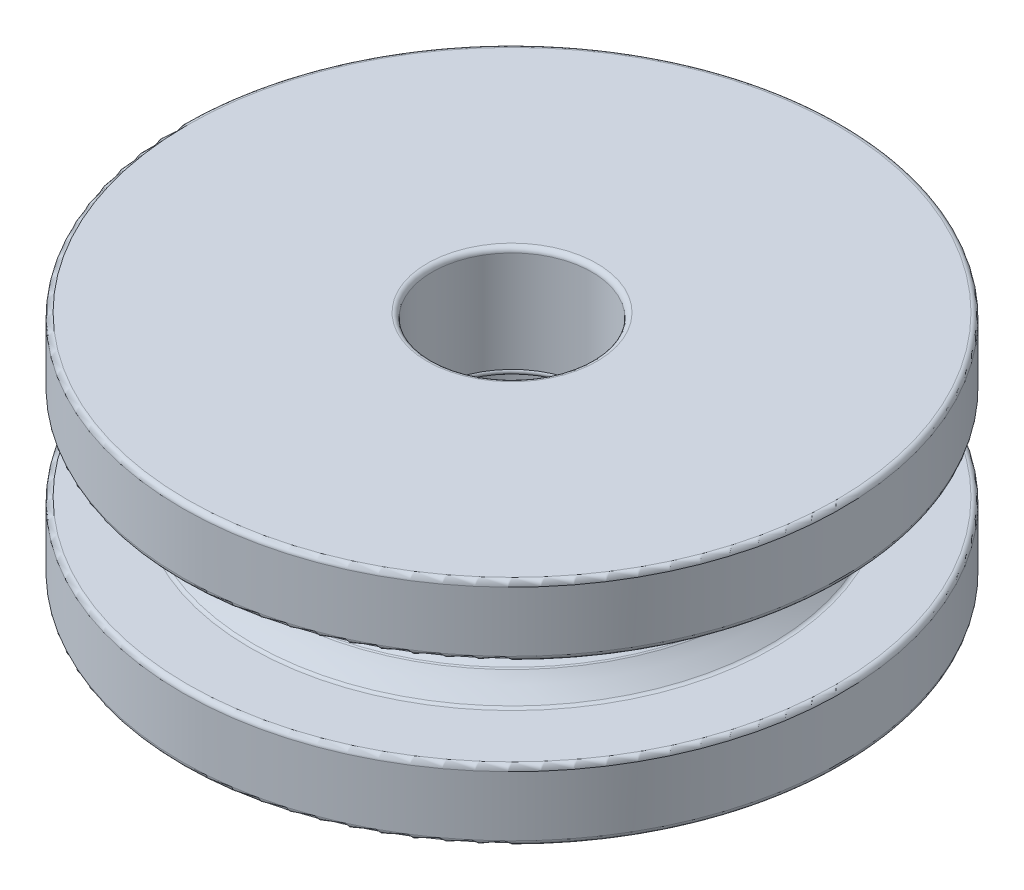
ISO-10303-21;
HEADER;
FILE_DESCRIPTION(('STEP AP214'),'2;1');
FILE_NAME('part.step','',(''),(''),'','','');
FILE_SCHEMA(('AUTOMOTIVE_DESIGN { 1 0 10303 214 1 1 1 1 }'));
ENDSEC;
DATA;
#1=APPLICATION_CONTEXT('core data for automotive mechanical design processes');
#2=APPLICATION_PROTOCOL_DEFINITION('international standard','automotive_design',2000,#1);
#3=PRODUCT_CONTEXT('',#1,'mechanical');
#4=PRODUCT('Part','Part','',(#3));
#5=PRODUCT_RELATED_PRODUCT_CATEGORY('part','',(#4));
#6=PRODUCT_DEFINITION_FORMATION('','',#4);
#7=PRODUCT_DEFINITION_CONTEXT('part definition',#1,'design');
#8=PRODUCT_DEFINITION('design','',#6,#7);
#9=PRODUCT_DEFINITION_SHAPE('','',#8);
#10=(LENGTH_UNIT() NAMED_UNIT(*) SI_UNIT(.MILLI.,.METRE.));
#11=(NAMED_UNIT(*) PLANE_ANGLE_UNIT() SI_UNIT($,.RADIAN.));
#12=(NAMED_UNIT(*) SI_UNIT($,.STERADIAN.) SOLID_ANGLE_UNIT());
#13=UNCERTAINTY_MEASURE_WITH_UNIT(LENGTH_MEASURE(1.E-05),#10,'distance_accuracy_value','');
#14=(GEOMETRIC_REPRESENTATION_CONTEXT(3) GLOBAL_UNCERTAINTY_ASSIGNED_CONTEXT((#13)) GLOBAL_UNIT_ASSIGNED_CONTEXT((#10,
#11,#12)) REPRESENTATION_CONTEXT('',''));
#15=CARTESIAN_POINT('',(0.,0.,0.));
#16=DIRECTION('',(0.,0.,1.));
#17=DIRECTION('',(1.,0.,0.));
#18=AXIS2_PLACEMENT_3D('',#15,#16,#17);
#19=CARTESIAN_POINT('',(0.,6.,0.));
#20=DIRECTION('',(0.,1.,0.));
#21=DIRECTION('',(0.,0.,1.));
#22=AXIS2_PLACEMENT_3D('',#19,#20,#21);
#23=PLANE('',#22);
#24=CARTESIAN_POINT('',(0.,6.,0.));
#25=DIRECTION('',(0.,-1.,0.));
#26=DIRECTION('',(0.,0.,-1.));
#27=AXIS2_PLACEMENT_3D('',#24,#25,#26);
#28=CIRCLE('',#27,4.2);
#29=CARTESIAN_POINT('',(0.,6.,-4.2));
#30=VERTEX_POINT('',#29);
#31=EDGE_CURVE('E124',#30,#30,#28,.T.);
#32=ORIENTED_EDGE('',*,*,#31,.T.);
#33=EDGE_LOOP('',(#32));
#34=FACE_BOUND('',#33,.T.);
#35=CARTESIAN_POINT('',(0.,6.,0.));
#36=DIRECTION('',(0.,1.,0.));
#37=DIRECTION('',(0.,0.,1.));
#38=AXIS2_PLACEMENT_3D('',#35,#36,#37);
#39=CIRCLE('',#38,8.);
#40=CARTESIAN_POINT('',(0.,6.,8.));
#41=VERTEX_POINT('',#40);
#42=EDGE_CURVE('E115',#41,#41,#39,.T.);
#43=ORIENTED_EDGE('',*,*,#42,.T.);
#44=EDGE_LOOP('',(#43));
#45=FACE_BOUND('',#44,.T.);
#46=ADVANCED_FACE('F47',(#34,#45),#23,.T.);
#47=CARTESIAN_POINT('',(0.,39.1304347826087,0.));
#48=DIRECTION('',(0.,1.,0.));
#49=DIRECTION('',(0.,0.,1.));
#50=AXIS2_PLACEMENT_3D('',#47,#48,#49);
#51=CYLINDRICAL_SURFACE('',#50,8.);
#52=CARTESIAN_POINT('',(0.,12.,0.));
#53=DIRECTION('',(0.,1.,0.));
#54=DIRECTION('',(0.,0.,1.));
#55=AXIS2_PLACEMENT_3D('',#52,#53,#54);
#56=CIRCLE('',#55,8.);
#57=CARTESIAN_POINT('',(0.,12.,8.));
#58=VERTEX_POINT('',#57);
#59=EDGE_CURVE('E118',#58,#58,#56,.T.);
#60=ORIENTED_EDGE('',*,*,#59,.T.);
#61=EDGE_LOOP('',(#60));
#62=FACE_BOUND('',#61,.T.);
#63=ORIENTED_EDGE('',*,*,#42,.F.);
#64=EDGE_LOOP('',(#63));
#65=FACE_BOUND('',#64,.T.);
#66=ADVANCED_FACE('F183',(#62,#65),#51,.F.);
#67=CARTESIAN_POINT('',(0.,12.1999861644354,0.));
#68=DIRECTION('',(0.,1.,0.));
#69=DIRECTION('',(0.,0.,1.));
#70=AXIS2_PLACEMENT_3D('',#67,#68,#69);
#71=TOROIDAL_SURFACE('',#70,8.25215006952186,0.321829339130951);
#72=CARTESIAN_POINT('',(0.,12.3999723288708,0.));
#73=DIRECTION('',(0.,1.,0.));
#74=DIRECTION('',(0.,0.,1.));
#75=AXIS2_PLACEMENT_3D('',#72,#73,#74);
#76=CIRCLE('',#75,8.);
#77=CARTESIAN_POINT('',(0.,12.3999723288708,8.));
#78=VERTEX_POINT('',#77);
#79=EDGE_CURVE('E121',#78,#78,#76,.T.);
#80=ORIENTED_EDGE('',*,*,#79,.T.);
#81=EDGE_LOOP('',(#80));
#82=FACE_BOUND('',#81,.T.);
#83=ORIENTED_EDGE('',*,*,#59,.F.);
#84=EDGE_LOOP('',(#83));
#85=FACE_BOUND('',#84,.T.);
#86=ADVANCED_FACE('F188',(#82,#85),#71,.T.);
#87=CARTESIAN_POINT('',(0.,39.1304347826087,0.));
#88=DIRECTION('',(0.,1.,0.));
#89=DIRECTION('',(0.,0.,1.));
#90=AXIS2_PLACEMENT_3D('',#87,#88,#89);
#91=CYLINDRICAL_SURFACE('',#90,8.);
#92=CARTESIAN_POINT('',(0.,22.5,0.));
#93=DIRECTION('',(0.,1.,0.));
#94=DIRECTION('',(0.,0.,1.));
#95=AXIS2_PLACEMENT_3D('',#92,#93,#94);
#96=CIRCLE('',#95,8.);
#97=CARTESIAN_POINT('',(0.,22.5,8.));
#98=VERTEX_POINT('',#97);
#99=EDGE_CURVE('E58',#98,#98,#96,.T.);
#100=ORIENTED_EDGE('',*,*,#99,.T.);
#101=EDGE_LOOP('',(#100));
#102=FACE_BOUND('',#101,.T.);
#103=ORIENTED_EDGE('',*,*,#79,.F.);
#104=EDGE_LOOP('',(#103));
#105=FACE_BOUND('',#104,.T.);
#106=ADVANCED_FACE('F229',(#102,#105),#91,.F.);
#107=CARTESIAN_POINT('',(0.,23.,33.));
#108=DIRECTION('',(0.,1.,0.));
#109=DIRECTION('',(0.,0.,1.));
#110=AXIS2_PLACEMENT_3D('',#107,#108,#109);
#111=PLANE('',#110);
#112=CARTESIAN_POINT('',(0.,23.,0.));
#113=DIRECTION('',(0.,1.,0.));
#114=DIRECTION('',(0.,0.,1.));
#115=AXIS2_PLACEMENT_3D('',#112,#113,#114);
#116=CIRCLE('',#115,8.5);
#117=CARTESIAN_POINT('',(0.,23.,8.5));
#118=VERTEX_POINT('',#117);
#119=EDGE_CURVE('E12',#118,#118,#116,.F.);
#120=ORIENTED_EDGE('',*,*,#119,.T.);
#121=EDGE_LOOP('',(#120));
#122=FACE_BOUND('',#121,.T.);
#123=CARTESIAN_POINT('',(0.,23.,0.));
#124=DIRECTION('',(0.,1.,0.));
#125=DIRECTION('',(0.,0.,1.));
#126=AXIS2_PLACEMENT_3D('',#123,#124,#125);
#127=CIRCLE('',#126,32.5);
#128=CARTESIAN_POINT('',(0.,23.,32.5));
#129=VERTEX_POINT('',#128);
#130=EDGE_CURVE('E54',#129,#129,#127,.T.);
#131=ORIENTED_EDGE('',*,*,#130,.T.);
#132=EDGE_LOOP('',(#131));
#133=FACE_BOUND('',#132,.T.);
#134=ADVANCED_FACE('F232',(#122,#133),#111,.T.);
#135=CARTESIAN_POINT('',(0.,39.1304347826087,0.));
#136=DIRECTION('',(0.,1.,0.));
#137=DIRECTION('',(0.,0.,1.));
#138=AXIS2_PLACEMENT_3D('',#135,#136,#137);
#139=CYLINDRICAL_SURFACE('',#138,33.);
#140=CARTESIAN_POINT('',(0.,16.5,0.));
#141=DIRECTION('',(0.,-1.,0.));
#142=DIRECTION('',(0.,0.,-1.));
#143=AXIS2_PLACEMENT_3D('',#140,#141,#142);
#144=CIRCLE('',#143,33.);
#145=CARTESIAN_POINT('',(0.,16.5,-33.));
#146=VERTEX_POINT('',#145);
#147=EDGE_CURVE('E79',#146,#146,#144,.F.);
#148=ORIENTED_EDGE('',*,*,#147,.T.);
#149=EDGE_LOOP('',(#148));
#150=FACE_BOUND('',#149,.T.);
#151=CARTESIAN_POINT('',(0.,22.5,0.));
#152=DIRECTION('',(0.,1.,0.));
#153=DIRECTION('',(0.,0.,1.));
#154=AXIS2_PLACEMENT_3D('',#151,#152,#153);
#155=CIRCLE('',#154,33.);
#156=CARTESIAN_POINT('',(0.,22.5,33.));
#157=VERTEX_POINT('',#156);
#158=EDGE_CURVE('E82',#157,#157,#155,.F.);
#159=ORIENTED_EDGE('',*,*,#158,.T.);
#160=EDGE_LOOP('',(#159));
#161=FACE_BOUND('',#160,.T.);
#162=ADVANCED_FACE('F245',(#150,#161),#139,.T.);
#163=CARTESIAN_POINT('',(0.,16.,33.));
#164=DIRECTION('',(0.,-1.,0.));
#165=DIRECTION('',(0.,0.,-1.));
#166=AXIS2_PLACEMENT_3D('',#163,#164,#165);
#167=PLANE('',#166);
#168=CARTESIAN_POINT('',(0.,16.,0.));
#169=DIRECTION('',(0.,-1.,0.));
#170=DIRECTION('',(0.,0.,-1.));
#171=AXIS2_PLACEMENT_3D('',#168,#169,#170);
#172=CIRCLE('',#171,32.5);
#173=CARTESIAN_POINT('',(0.,16.,-32.5));
#174=VERTEX_POINT('',#173);
#175=EDGE_CURVE('E73',#174,#174,#172,.T.);
#176=ORIENTED_EDGE('',*,*,#175,.T.);
#177=EDGE_LOOP('',(#176));
#178=FACE_BOUND('',#177,.T.);
#179=CARTESIAN_POINT('',(0.,16.,0.));
#180=DIRECTION('',(0.,-1.,0.));
#181=DIRECTION('',(0.,0.,-1.));
#182=AXIS2_PLACEMENT_3D('',#179,#180,#181);
#183=CIRCLE('',#182,26.2070983904245);
#184=CARTESIAN_POINT('',(0.,16.,-26.2070983904245));
#185=VERTEX_POINT('',#184);
#186=EDGE_CURVE('E76',#185,#185,#183,.F.);
#187=ORIENTED_EDGE('',*,*,#186,.T.);
#188=EDGE_LOOP('',(#187));
#189=FACE_BOUND('',#188,.T.);
#190=ADVANCED_FACE('F151',(#178,#189),#167,.T.);
#191=CARTESIAN_POINT('',(0.,16.,26.));
#192=CARTESIAN_POINT('',(0.,14.620109751411,24.6126431025041));
#193=CARTESIAN_POINT('',(0.,13.7977511971225,24.0805854446736));
#194=(BOUNDED_CURVE() B_SPLINE_CURVE(2,(#191,#192,#193),.UNSPECIFIED.,.F.,
.F.) B_SPLINE_CURVE_WITH_KNOTS((3,3),(0.,1.),
.UNSPECIFIED.) CURVE() GEOMETRIC_REPRESENTATION_ITEM() RATIONAL_B_SPLINE_CURVE((1.,
1.04569750363022,1.)) REPRESENTATION_ITEM(''));
#195=CARTESIAN_POINT('',(0.,39.1304347826087,0.));
#196=DIRECTION('',(0.,1.,0.));
#197=AXIS1_PLACEMENT('',#195,#196);
#198=SURFACE_OF_REVOLUTION('',#194,#197);
#199=CARTESIAN_POINT('',(0.,13.8704099388208,0.));
#200=DIRECTION('',(0.,1.,0.));
#201=DIRECTION('',(0.,0.,1.));
#202=AXIS2_PLACEMENT_3D('',#199,#200,#201);
#203=CIRCLE('',#202,24.1284604011919);
#204=CARTESIAN_POINT('',(0.,13.8704099388208,24.1284604011919));
#205=VERTEX_POINT('',#204);
#206=EDGE_CURVE('E97',#205,#205,#203,.T.);
#207=ORIENTED_EDGE('',*,*,#206,.T.);
#208=EDGE_LOOP('',(#207));
#209=FACE_BOUND('',#208,.T.);
#210=CARTESIAN_POINT('',(0.,15.8525783641473,0.));
#211=DIRECTION('',(0.,1.,0.));
#212=DIRECTION('',(0.,0.,1.));
#213=AXIS2_PLACEMENT_3D('',#210,#211,#212);
#214=CIRCLE('',#213,25.8525726549197);
#215=CARTESIAN_POINT('',(0.,15.8525783641473,25.8525726549197));
#216=VERTEX_POINT('',#215);
#217=EDGE_CURVE('E100',#216,#216,#214,.F.);
#218=ORIENTED_EDGE('',*,*,#217,.T.);
#219=EDGE_LOOP('',(#218));
#220=FACE_BOUND('',#219,.T.);
#221=ADVANCED_FACE('F147',(#209,#220),#198,.F.);
#222=CARTESIAN_POINT('',(0.,13.7977511971225,24.0805854446736));
#223=CARTESIAN_POINT('',(0.,11.4741755753678,20.869655080194));
#224=CARTESIAN_POINT('',(0.,9.15059995361322,24.0805854446736));
#225=(BOUNDED_CURVE() B_SPLINE_CURVE(2,(#222,#223,#224),.UNSPECIFIED.,.F.,
.F.) B_SPLINE_CURVE_WITH_KNOTS((3,3),(0.,1.),
.UNSPECIFIED.) CURVE() GEOMETRIC_REPRESENTATION_ITEM() RATIONAL_B_SPLINE_CURVE((1.,
1.84066421515904,1.)) REPRESENTATION_ITEM(''));
#226=CARTESIAN_POINT('',(0.,39.1304347826087,0.));
#227=DIRECTION('',(0.,1.,0.));
#228=AXIS1_PLACEMENT('',#226,#227);
#229=SURFACE_OF_REVOLUTION('',#225,#228);
#230=CARTESIAN_POINT('',(0.,9.19925830477696,0.));
#231=DIRECTION('',(0.,1.,0.));
#232=DIRECTION('',(0.,0.,1.));
#233=AXIS2_PLACEMENT_3D('',#230,#231,#232);
#234=CIRCLE('',#233,24.0135557743792);
#235=CARTESIAN_POINT('',(0.,9.19925830477696,24.0135557743792));
#236=VERTEX_POINT('',#235);
#237=EDGE_CURVE('E109',#236,#236,#234,.T.);
#238=ORIENTED_EDGE('',*,*,#237,.T.);
#239=EDGE_LOOP('',(#238));
#240=FACE_BOUND('',#239,.T.);
#241=CARTESIAN_POINT('',(0.,13.7447845384978,0.));
#242=DIRECTION('',(0.,1.,0.));
#243=DIRECTION('',(0.,0.,1.));
#244=AXIS2_PLACEMENT_3D('',#241,#242,#243);
#245=CIRCLE('',#244,24.0076414925512);
#246=CARTESIAN_POINT('',(0.,13.7447845384978,24.0076414925512));
#247=VERTEX_POINT('',#246);
#248=EDGE_CURVE('E112',#247,#247,#245,.F.);
#249=ORIENTED_EDGE('',*,*,#248,.T.);
#250=EDGE_LOOP('',(#249));
#251=FACE_BOUND('',#250,.T.);
#252=ADVANCED_FACE('F142',(#240,#251),#229,.F.);
#253=CARTESIAN_POINT('',(0.,9.15059995361322,24.0805854446736));
#254=CARTESIAN_POINT('',(0.,8.3798902485889,24.6126431025042));
#255=CARTESIAN_POINT('',(0.,7.,26.));
#256=(BOUNDED_CURVE() B_SPLINE_CURVE(2,(#253,#254,#255),.UNSPECIFIED.,.F.,
.F.) B_SPLINE_CURVE_WITH_KNOTS((3,3),(0.,1.),
.UNSPECIFIED.) CURVE() GEOMETRIC_REPRESENTATION_ITEM() RATIONAL_B_SPLINE_CURVE((1.,
1.0456975036304,1.)) REPRESENTATION_ITEM(''));
#257=CARTESIAN_POINT('',(0.,39.1304347826087,0.));
#258=DIRECTION('',(0.,1.,0.));
#259=AXIS1_PLACEMENT('',#257,#258);
#260=SURFACE_OF_REVOLUTION('',#256,#259);
#261=CARTESIAN_POINT('',(0.,9.0849621398738,0.));
#262=DIRECTION('',(0.,1.,0.));
#263=DIRECTION('',(0.,0.,1.));
#264=AXIS2_PLACEMENT_3D('',#261,#262,#263);
#265=CIRCLE('',#264,24.126602729298);
#266=CARTESIAN_POINT('',(0.,9.0849621398738,24.126602729298));
#267=VERTEX_POINT('',#266);
#268=EDGE_CURVE('E103',#267,#267,#265,.F.);
#269=ORIENTED_EDGE('',*,*,#268,.T.);
#270=EDGE_LOOP('',(#269));
#271=FACE_BOUND('',#270,.T.);
#272=CARTESIAN_POINT('',(0.,7.14708048063133,0.));
#273=DIRECTION('',(0.,1.,0.));
#274=DIRECTION('',(0.,0.,1.));
#275=AXIS2_PLACEMENT_3D('',#272,#273,#274);
#276=CIRCLE('',#275,25.8527743045225);
#277=CARTESIAN_POINT('',(0.,7.14708048063133,25.8527743045225));
#278=VERTEX_POINT('',#277);
#279=EDGE_CURVE('E106',#278,#278,#276,.T.);
#280=ORIENTED_EDGE('',*,*,#279,.T.);
#281=EDGE_LOOP('',(#280));
#282=FACE_BOUND('',#281,.T.);
#283=ADVANCED_FACE('F137',(#271,#282),#260,.F.);
#284=CARTESIAN_POINT('',(0.,7.,33.));
#285=DIRECTION('',(0.,1.,0.));
#286=DIRECTION('',(0.,0.,1.));
#287=AXIS2_PLACEMENT_3D('',#284,#285,#286);
#288=PLANE('',#287);
#289=CARTESIAN_POINT('',(0.,7.,0.));
#290=DIRECTION('',(0.,1.,0.));
#291=DIRECTION('',(0.,0.,1.));
#292=AXIS2_PLACEMENT_3D('',#289,#290,#291);
#293=CIRCLE('',#292,26.206960431931);
#294=CARTESIAN_POINT('',(0.,7.,26.206960431931));
#295=VERTEX_POINT('',#294);
#296=EDGE_CURVE('E91',#295,#295,#293,.F.);
#297=ORIENTED_EDGE('',*,*,#296,.T.);
#298=EDGE_LOOP('',(#297));
#299=FACE_BOUND('',#298,.T.);
#300=CARTESIAN_POINT('',(0.,7.,0.));
#301=DIRECTION('',(0.,1.,0.));
#302=DIRECTION('',(0.,0.,1.));
#303=AXIS2_PLACEMENT_3D('',#300,#301,#302);
#304=CIRCLE('',#303,32.5);
#305=CARTESIAN_POINT('',(0.,7.,32.5));
#306=VERTEX_POINT('',#305);
#307=EDGE_CURVE('E94',#306,#306,#304,.T.);
#308=ORIENTED_EDGE('',*,*,#307,.T.);
#309=EDGE_LOOP('',(#308));
#310=FACE_BOUND('',#309,.T.);
#311=ADVANCED_FACE('F141',(#299,#310),#288,.T.);
#312=CARTESIAN_POINT('',(0.,39.1304347826087,0.));
#313=DIRECTION('',(0.,1.,0.));
#314=DIRECTION('',(0.,0.,1.));
#315=AXIS2_PLACEMENT_3D('',#312,#313,#314);
#316=CYLINDRICAL_SURFACE('',#315,33.);
#317=CARTESIAN_POINT('',(0.,6.5,0.));
#318=DIRECTION('',(0.,1.,0.));
#319=DIRECTION('',(0.,0.,1.));
#320=AXIS2_PLACEMENT_3D('',#317,#318,#319);
#321=CIRCLE('',#320,33.);
#322=CARTESIAN_POINT('',(0.,6.5,33.));
#323=VERTEX_POINT('',#322);
#324=EDGE_CURVE('E85',#323,#323,#321,.F.);
#325=ORIENTED_EDGE('',*,*,#324,.T.);
#326=EDGE_LOOP('',(#325));
#327=FACE_BOUND('',#326,.T.);
#328=CARTESIAN_POINT('',(0.,0.5,0.));
#329=DIRECTION('',(0.,-1.,0.));
#330=DIRECTION('',(0.,0.,-1.));
#331=AXIS2_PLACEMENT_3D('',#328,#329,#330);
#332=CIRCLE('',#331,33.);
#333=CARTESIAN_POINT('',(0.,0.5,-33.));
#334=VERTEX_POINT('',#333);
#335=EDGE_CURVE('E88',#334,#334,#332,.F.);
#336=ORIENTED_EDGE('',*,*,#335,.T.);
#337=EDGE_LOOP('',(#336));
#338=FACE_BOUND('',#337,.T.);
#339=ADVANCED_FACE('F179',(#327,#338),#316,.T.);
#340=CARTESIAN_POINT('',(0.,0.,33.));
#341=DIRECTION('',(0.,-1.,0.));
#342=DIRECTION('',(0.,0.,-1.));
#343=AXIS2_PLACEMENT_3D('',#340,#341,#342);
#344=PLANE('',#343);
#345=CARTESIAN_POINT('',(0.,0.,0.));
#346=DIRECTION('',(0.,-1.,0.));
#347=DIRECTION('',(0.,0.,-1.));
#348=AXIS2_PLACEMENT_3D('',#345,#346,#347);
#349=CIRCLE('',#348,32.5);
#350=CARTESIAN_POINT('',(0.,0.,-32.5));
#351=VERTEX_POINT('',#350);
#352=EDGE_CURVE('E67',#351,#351,#349,.T.);
#353=ORIENTED_EDGE('',*,*,#352,.T.);
#354=EDGE_LOOP('',(#353));
#355=FACE_BOUND('',#354,.T.);
#356=CARTESIAN_POINT('',(0.,0.,0.));
#357=DIRECTION('',(0.,-1.,0.));
#358=DIRECTION('',(0.,0.,-1.));
#359=AXIS2_PLACEMENT_3D('',#356,#357,#358);
#360=CIRCLE('',#359,4.84419396487596);
#361=CARTESIAN_POINT('',(0.,0.,-4.84419396487596));
#362=VERTEX_POINT('',#361);
#363=EDGE_CURVE('E70',#362,#362,#360,.F.);
#364=ORIENTED_EDGE('',*,*,#363,.T.);
#365=EDGE_LOOP('',(#364));
#366=FACE_BOUND('',#365,.T.);
#367=ADVANCED_FACE('F169',(#355,#366),#344,.T.);
#368=CARTESIAN_POINT('',(0.,6.,0.));
#369=DIRECTION('',(0.,-1.,0.));
#370=DIRECTION('',(0.,0.,-1.));
#371=AXIS2_PLACEMENT_3D('',#368,#369,#370);
#372=CONICAL_SURFACE('',#371,4.2,0.026179938779915);
#373=CARTESIAN_POINT('',(0.,0.48691152584604,0.));
#374=DIRECTION('',(0.,1.,0.));
#375=DIRECTION('',(0.,0.,1.));
#376=AXIS2_PLACEMENT_3D('',#373,#374,#375);
#377=CIRCLE('',#376,4.34436530238819);
#378=CARTESIAN_POINT('',(0.,0.48691152584604,4.34436530238819));
#379=VERTEX_POINT('',#378);
#380=EDGE_CURVE('E62',#379,#379,#377,.F.);
#381=ORIENTED_EDGE('',*,*,#380,.T.);
#382=EDGE_LOOP('',(#381));
#383=FACE_BOUND('',#382,.T.);
#384=ORIENTED_EDGE('',*,*,#31,.F.);
#385=EDGE_LOOP('',(#384));
#386=FACE_BOUND('',#385,.T.);
#387=ADVANCED_FACE('F166',(#383,#386),#372,.F.);
#388=CARTESIAN_POINT('',(0.,8.79507790039815,0.));
#389=DIRECTION('',(0.,-1.,0.));
#390=DIRECTION('',(0.,0.,-1.));
#391=AXIS2_PLACEMENT_3D('',#388,#389,#390);
#392=TOROIDAL_SURFACE('',#391,23.7192120964851,0.5);
#393=ORIENTED_EDGE('',*,*,#268,.F.);
#394=EDGE_LOOP('',(#393));
#395=FACE_BOUND('',#394,.T.);
#396=ORIENTED_EDGE('',*,*,#237,.F.);
#397=EDGE_LOOP('',(#396));
#398=FACE_BOUND('',#397,.T.);
#399=ADVANCED_FACE('F168',(#395,#398),#392,.T.);
#400=CARTESIAN_POINT('',(0.,14.1488840860492,0.));
#401=DIRECTION('',(0.,-1.,0.));
#402=DIRECTION('',(0.,0.,-1.));
#403=AXIS2_PLACEMENT_3D('',#400,#401,#402);
#404=TOROIDAL_SURFACE('',#403,23.7131868174842,0.5);
#405=ORIENTED_EDGE('',*,*,#248,.F.);
#406=EDGE_LOOP('',(#405));
#407=FACE_BOUND('',#406,.T.);
#408=ORIENTED_EDGE('',*,*,#206,.F.);
#409=EDGE_LOOP('',(#408));
#410=FACE_BOUND('',#409,.T.);
#411=ADVANCED_FACE('F176',(#407,#410),#404,.T.);
#412=CARTESIAN_POINT('',(0.,7.5,0.));
#413=DIRECTION('',(0.,1.,0.));
#414=DIRECTION('',(0.,0.,1.));
#415=AXIS2_PLACEMENT_3D('',#412,#413,#414);
#416=TOROIDAL_SURFACE('',#415,26.206960431931,0.5);
#417=ORIENTED_EDGE('',*,*,#296,.F.);
#418=EDGE_LOOP('',(#417));
#419=FACE_BOUND('',#418,.T.);
#420=ORIENTED_EDGE('',*,*,#279,.F.);
#421=EDGE_LOOP('',(#420));
#422=FACE_BOUND('',#421,.T.);
#423=ADVANCED_FACE('F195',(#419,#422),#416,.F.);
#424=CARTESIAN_POINT('',(0.,6.5,0.));
#425=DIRECTION('',(0.,1.,0.));
#426=DIRECTION('',(0.,0.,1.));
#427=AXIS2_PLACEMENT_3D('',#424,#425,#426);
#428=TOROIDAL_SURFACE('',#427,32.5,0.5);
#429=ORIENTED_EDGE('',*,*,#324,.F.);
#430=EDGE_LOOP('',(#429));
#431=FACE_BOUND('',#430,.T.);
#432=ORIENTED_EDGE('',*,*,#307,.F.);
#433=EDGE_LOOP('',(#432));
#434=FACE_BOUND('',#433,.T.);
#435=ADVANCED_FACE('F199',(#431,#434),#428,.T.);
#436=CARTESIAN_POINT('',(0.,16.5,0.));
#437=DIRECTION('',(0.,-1.,0.));
#438=DIRECTION('',(0.,0.,-1.));
#439=AXIS2_PLACEMENT_3D('',#436,#437,#438);
#440=TOROIDAL_SURFACE('',#439,32.5,0.5);
#441=ORIENTED_EDGE('',*,*,#175,.F.);
#442=EDGE_LOOP('',(#441));
#443=FACE_BOUND('',#442,.T.);
#444=ORIENTED_EDGE('',*,*,#147,.F.);
#445=EDGE_LOOP('',(#444));
#446=FACE_BOUND('',#445,.T.);
#447=ADVANCED_FACE('F203',(#443,#446),#440,.T.);
#448=CARTESIAN_POINT('',(0.,15.5,0.));
#449=DIRECTION('',(0.,1.,0.));
#450=DIRECTION('',(0.,0.,1.));
#451=AXIS2_PLACEMENT_3D('',#448,#449,#450);
#452=TOROIDAL_SURFACE('',#451,26.2070983904245,0.5);
#453=ORIENTED_EDGE('',*,*,#217,.F.);
#454=EDGE_LOOP('',(#453));
#455=FACE_BOUND('',#454,.T.);
#456=ORIENTED_EDGE('',*,*,#186,.F.);
#457=EDGE_LOOP('',(#456));
#458=FACE_BOUND('',#457,.T.);
#459=ADVANCED_FACE('F207',(#455,#458),#452,.F.);
#460=CARTESIAN_POINT('',(0.,0.5,0.));
#461=DIRECTION('',(0.,-1.,0.));
#462=DIRECTION('',(0.,0.,-1.));
#463=AXIS2_PLACEMENT_3D('',#460,#461,#462);
#464=TOROIDAL_SURFACE('',#463,32.5,0.5);
#465=ORIENTED_EDGE('',*,*,#352,.F.);
#466=EDGE_LOOP('',(#465));
#467=FACE_BOUND('',#466,.T.);
#468=ORIENTED_EDGE('',*,*,#335,.F.);
#469=EDGE_LOOP('',(#468));
#470=FACE_BOUND('',#469,.T.);
#471=ADVANCED_FACE('F211',(#467,#470),#464,.T.);
#472=CARTESIAN_POINT('',(0.,0.499999999999998,0.));
#473=DIRECTION('',(0.,-1.,0.));
#474=DIRECTION('',(0.,0.,-1.));
#475=AXIS2_PLACEMENT_3D('',#472,#473,#474);
#476=TOROIDAL_SURFACE('',#475,4.84419396487596,0.5);
#477=ORIENTED_EDGE('',*,*,#363,.F.);
#478=EDGE_LOOP('',(#477));
#479=FACE_BOUND('',#478,.T.);
#480=ORIENTED_EDGE('',*,*,#380,.F.);
#481=EDGE_LOOP('',(#480));
#482=FACE_BOUND('',#481,.T.);
#483=ADVANCED_FACE('F215',(#479,#482),#476,.T.);
#484=CARTESIAN_POINT('',(0.,22.5,0.));
#485=DIRECTION('',(0.,1.,0.));
#486=DIRECTION('',(0.,0.,1.));
#487=AXIS2_PLACEMENT_3D('',#484,#485,#486);
#488=TOROIDAL_SURFACE('',#487,8.5,0.5);
#489=ORIENTED_EDGE('',*,*,#119,.F.);
#490=EDGE_LOOP('',(#489));
#491=FACE_BOUND('',#490,.T.);
#492=ORIENTED_EDGE('',*,*,#99,.F.);
#493=EDGE_LOOP('',(#492));
#494=FACE_BOUND('',#493,.T.);
#495=ADVANCED_FACE('F218',(#491,#494),#488,.T.);
#496=CARTESIAN_POINT('',(0.,22.5,0.));
#497=DIRECTION('',(0.,1.,0.));
#498=DIRECTION('',(0.,0.,1.));
#499=AXIS2_PLACEMENT_3D('',#496,#497,#498);
#500=TOROIDAL_SURFACE('',#499,32.5,0.5);
#501=ORIENTED_EDGE('',*,*,#158,.F.);
#502=EDGE_LOOP('',(#501));
#503=FACE_BOUND('',#502,.T.);
#504=ORIENTED_EDGE('',*,*,#130,.F.);
#505=EDGE_LOOP('',(#504));
#506=FACE_BOUND('',#505,.T.);
#507=ADVANCED_FACE('F49',(#503,#506),#500,.T.);
#508=CLOSED_SHELL('',(#46,#66,#86,#106,#134,#162,#190,#221,#252,#283,#311,#339,#367,#387,#399,
#411,#423,#435,#447,#459,#471,#483,#495,#507));
#509=MANIFOLD_SOLID_BREP('B2',#508);
#510=ADVANCED_BREP_SHAPE_REPRESENTATION('',(#18,#509),#14);
#511=SHAPE_DEFINITION_REPRESENTATION(#9,#510);
ENDSEC;
END-ISO-10303-21;
